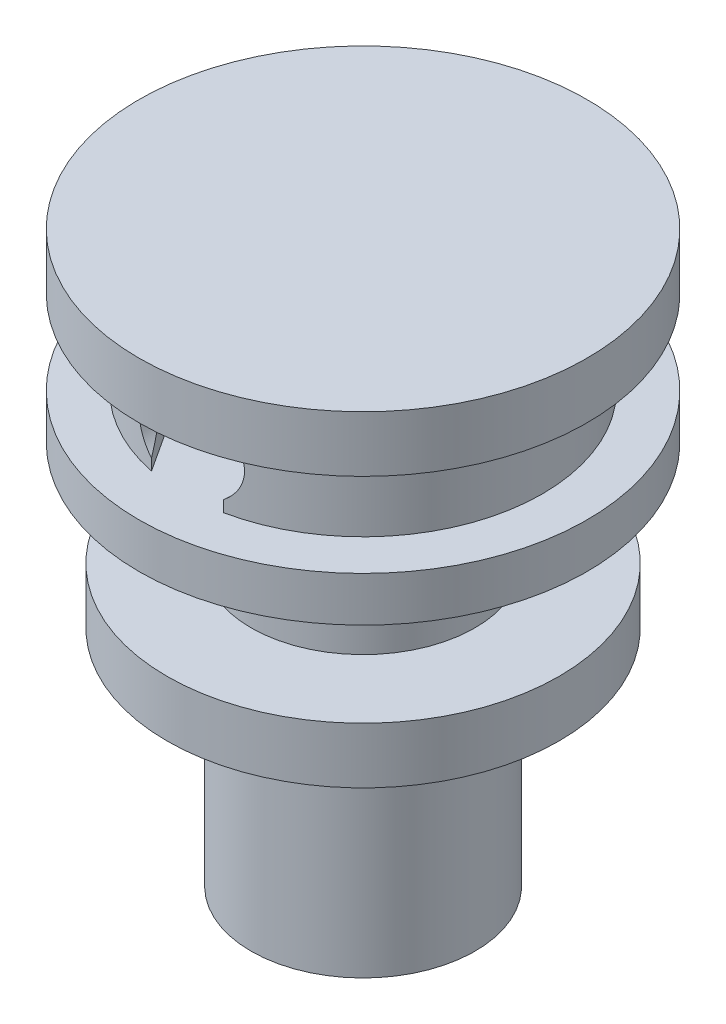
ISO-10303-21;
HEADER;
FILE_DESCRIPTION(('STEP AP214'),'2;1');
FILE_NAME('part.step','',(''),(''),'','','');
FILE_SCHEMA(('AUTOMOTIVE_DESIGN { 1 0 10303 214 1 1 1 1 }'));
ENDSEC;
DATA;
#1=APPLICATION_CONTEXT('core data for automotive mechanical design processes');
#2=APPLICATION_PROTOCOL_DEFINITION('international standard','automotive_design',2000,#1);
#3=PRODUCT_CONTEXT('',#1,'mechanical');
#4=PRODUCT('Part','Part','',(#3));
#5=PRODUCT_RELATED_PRODUCT_CATEGORY('part','',(#4));
#6=PRODUCT_DEFINITION_FORMATION('','',#4);
#7=PRODUCT_DEFINITION_CONTEXT('part definition',#1,'design');
#8=PRODUCT_DEFINITION('design','',#6,#7);
#9=PRODUCT_DEFINITION_SHAPE('','',#8);
#10=(LENGTH_UNIT() NAMED_UNIT(*) SI_UNIT(.MILLI.,.METRE.));
#11=(NAMED_UNIT(*) PLANE_ANGLE_UNIT() SI_UNIT($,.RADIAN.));
#12=(NAMED_UNIT(*) SI_UNIT($,.STERADIAN.) SOLID_ANGLE_UNIT());
#13=UNCERTAINTY_MEASURE_WITH_UNIT(LENGTH_MEASURE(1.E-05),#10,'distance_accuracy_value','');
#14=(GEOMETRIC_REPRESENTATION_CONTEXT(3) GLOBAL_UNCERTAINTY_ASSIGNED_CONTEXT((#13)) GLOBAL_UNIT_ASSIGNED_CONTEXT((#10,
#11,#12)) REPRESENTATION_CONTEXT('',''));
#15=CARTESIAN_POINT('',(0.,0.,0.));
#16=DIRECTION('',(0.,0.,1.));
#17=DIRECTION('',(1.,0.,0.));
#18=AXIS2_PLACEMENT_3D('',#15,#16,#17);
#19=CARTESIAN_POINT('',(0.,4.21,10.));
#20=DIRECTION('',(0.,0.,1.));
#21=DIRECTION('',(-1.,0.,0.));
#22=AXIS2_PLACEMENT_3D('',#19,#20,#21);
#23=ELLIPSE('',#22,0.471075948855967,0.375);
#24=DIRECTION('',(0.,0.,-1.));
#25=VECTOR('',#24,1.);
#26=SURFACE_OF_LINEAR_EXTRUSION('',#23,#25);
#27=CARTESIAN_POINT('',(0.,4.585,1.6));
#28=CARTESIAN_POINT('',(-0.0249516666663415,4.58500013315731,1.6000000267926));
#29=CARTESIAN_POINT('',(-0.0499039383212317,4.58342246563411,1.59941322943097));
#30=CARTESIAN_POINT('',(-0.099598947251716,4.57707482356927,1.59709250950286));
#31=CARTESIAN_POINT('',(-0.124337200657875,4.57227356227364,1.59534734626653));
#32=CARTESIAN_POINT('',(-0.1728641251852,4.55943321698894,1.5908214145249));
#33=CARTESIAN_POINT('',(-0.196652621004165,4.55139353827555,1.58804045580636));
#34=CARTESIAN_POINT('',(-0.246992271708044,4.53026335285002,1.58105978706783));
#35=CARTESIAN_POINT('',(-0.273252439835324,4.51651782073646,1.57669358380344));
#36=CARTESIAN_POINT('',(-0.318465517388156,4.48712808961465,1.56812551900529));
#37=CARTESIAN_POINT('',(-0.337902460227307,4.47220097951506,1.56402131434472));
#38=CARTESIAN_POINT('',(-0.372040789261528,4.44086115468295,1.55623255412026));
#39=CARTESIAN_POINT('',(-0.387023500134319,4.42475839139576,1.5525481831847));
#40=CARTESIAN_POINT('',(-0.412491710729826,4.39201780541613,1.54596397981887));
#41=CARTESIAN_POINT('',(-0.423290974912439,4.37563491800139,1.54302243725282));
#42=CARTESIAN_POINT('',(-0.441187908069004,4.34257079474494,1.53799635852982));
#43=CARTESIAN_POINT('',(-0.448515881475457,4.32602323880347,1.53586144563928));
#44=CARTESIAN_POINT('',(-0.460253564015261,4.29185290921683,1.5323853001843));
#45=CARTESIAN_POINT('',(-0.464667266067415,4.27423164302288,1.53104298193328));
#46=CARTESIAN_POINT('',(-0.470130888659651,4.23929601647315,1.52937404882635));
#47=CARTESIAN_POINT('',(-0.47133294237439,4.22200792166866,1.52900151928137));
#48=CARTESIAN_POINT('',(-0.47074545306544,4.18856418139041,1.5291823098784));
#49=CARTESIAN_POINT('',(-0.469136759731347,4.17240477643029,1.529679662009));
#50=CARTESIAN_POINT('',(-0.463373205413039,4.14057055868185,1.531435357817));
#51=CARTESIAN_POINT('',(-0.459214476183783,4.12489652018363,1.53269485758651));
#52=CARTESIAN_POINT('',(-0.448507508425452,4.0942036143585,1.53586193403231));
#53=CARTESIAN_POINT('',(-0.441925149126799,4.07919771273831,1.53777873660901));
#54=CARTESIAN_POINT('',(-0.426697286338026,4.05033100082443,1.54207435579127));
#55=CARTESIAN_POINT('',(-0.41804779771289,4.03647247285957,1.54445406314279));
#56=CARTESIAN_POINT('',(-0.386722328954688,3.99306235476459,1.55272088761728));
#57=CARTESIAN_POINT('',(-0.360307665645965,3.96623627201828,1.55918460620014));
#58=CARTESIAN_POINT('',(-0.313460754726294,3.9293705571627,1.56910015590525));
#59=CARTESIAN_POINT('',(-0.294826920725884,3.91689782928773,1.5727275159473));
#60=CARTESIAN_POINT('',(-0.250781248864582,3.89164453673094,1.58041954862946));
#61=CARTESIAN_POINT('',(-0.224880625587543,3.87965589761911,1.58434594201211));
#62=CARTESIAN_POINT('',(-0.171414269040135,3.85991898875293,1.59102023441097));
#63=CARTESIAN_POINT('',(-0.143849222124852,3.85216898420324,1.59376861546623));
#64=CARTESIAN_POINT('',(-0.0877782691064239,3.84084998963917,1.59783736046648));
#65=CARTESIAN_POINT('',(-0.0592725432228299,3.83728020348628,1.5991579963273));
#66=CARTESIAN_POINT('',(-0.00201927615530071,3.83430854326594,1.60025496745935));
#67=CARTESIAN_POINT('',(0.0267282512880739,3.83490643394396,1.60003138989743));
#68=CARTESIAN_POINT('',(0.0837828057941562,3.84027085556849,1.59805980740341));
#69=CARTESIAN_POINT('',(0.112089810142329,3.84503760075206,1.59631172412712));
#70=CARTESIAN_POINT('',(0.167560437790685,3.85876249276263,1.59144544020904));
#71=CARTESIAN_POINT('',(0.194723850778796,3.86772140691174,1.58832698874549));
#72=CARTESIAN_POINT('',(0.246141370079146,3.88945557009232,1.58115859373481));
#73=CARTESIAN_POINT('',(0.270466494072745,3.90207450202175,1.57714812384405));
#74=CARTESIAN_POINT('',(0.314423501940366,3.92994619803973,1.56894599024662));
#75=CARTESIAN_POINT('',(0.334281030533592,3.94485485597802,1.56480401295242));
#76=CARTESIAN_POINT('',(0.369093719925617,3.97615243266746,1.55693717042086));
#77=CARTESIAN_POINT('',(0.384346705853856,3.9922076834966,1.55321555947105));
#78=CARTESIAN_POINT('',(0.41032979355762,4.02490322635543,1.5465411386784));
#79=CARTESIAN_POINT('',(0.421373134474747,4.041283892899,1.54354880457716));
#80=CARTESIAN_POINT('',(0.439581273164447,4.0741157888367,1.53845676705662));
#81=CARTESIAN_POINT('',(0.447018979130038,4.09040492783576,1.5362985262503));
#82=CARTESIAN_POINT('',(0.458713234779058,4.1230801339998,1.5328461842998));
#83=CARTESIAN_POINT('',(0.463133093368483,4.1394024453457,1.53150821196028));
#84=CARTESIAN_POINT('',(0.469203037625912,4.1726174407289,1.52965975782721));
#85=CARTESIAN_POINT('',(0.470851690857531,4.18951041514295,1.52914970398951));
#86=CARTESIAN_POINT('',(0.471253212170051,4.22299101283535,1.52902595401815));
#87=CARTESIAN_POINT('',(0.470064030046771,4.2395778941467,1.52939432006743));
#88=CARTESIAN_POINT('',(0.464993281984365,4.27228924526329,1.53094354089086));
#89=CARTESIAN_POINT('',(0.461111695415712,4.28841371152447,1.53212440189045));
#90=CARTESIAN_POINT('',(0.45095992532073,4.3195883238623,1.53514235910241));
#91=CARTESIAN_POINT('',(0.444720899350902,4.33464956545269,1.53697087650171));
#92=CARTESIAN_POINT('',(0.430158085164483,4.36366864313923,1.54111079365168));
#93=CARTESIAN_POINT('',(0.421830365424813,4.37762433233685,1.54342310266091));
#94=CARTESIAN_POINT('',(0.39165797032821,4.42120654615372,1.55147145016712));
#95=CARTESIAN_POINT('',(0.366083066633359,4.44821418018224,1.55782465000811));
#96=CARTESIAN_POINT('',(0.320545468468471,4.48549794875778,1.56766191090465));
#97=CARTESIAN_POINT('',(0.30240793094766,4.49815262514438,1.57128038121385));
#98=CARTESIAN_POINT('',(0.264502927592219,4.52087817441184,1.57810242812948));
#99=CARTESIAN_POINT('',(0.244736100562765,4.53095005363747,1.58130616608792));
#100=CARTESIAN_POINT('',(0.197365808431365,4.55137762679415,1.58801389388489));
#101=CARTESIAN_POINT('',(0.169305259114804,4.56075928112403,1.59127637719777));
#102=CARTESIAN_POINT('',(0.117715743472245,4.57360641825129,1.59583059154853));
#103=CARTESIAN_POINT('',(0.0944042259623301,4.57788030273025,1.597386107106));
#104=CARTESIAN_POINT('',(0.0473952279184029,4.58357652633693,1.59947061716346));
#105=CARTESIAN_POINT('',(0.0236978868175716,4.58499987353362,1.59999997455369));
#106=CARTESIAN_POINT('',(0.,4.585,1.6));
#107=B_SPLINE_CURVE_WITH_KNOTS('',3,(#27,#28,#29,#30,#31,#32,#33,#34,#35,#36,#37,#38,#39,#40,
#41,#42,#43,#44,#45,#46,#47,#48,#49,#50,#51,#52,#53,#54,#55,#56,#57,#58,#59,#60,#61,#62,#63,#64,
#65,#66,#67,#68,#69,#70,#71,#72,#73,#74,#75,#76,#77,#78,#79,#80,#81,#82,#83,#84,#85,#86,#87,#88,
#89,#90,#91,#92,#93,#94,#95,#96,#97,#98,#99,#100,#101,#102,#103,#104,#105,#106),.UNSPECIFIED.,
.T.,.F.,(4,2,2,2,2,2,2,2,2,2,2,2,2,2,2,2,2,2,2,2,2,2,2,2,2,2,2,2,2,2,2,2,2,2,2,2,2,2,2,4),(0.,
0.0748000698317252,0.150336816218589,0.225887441000673,0.315262564446357,0.389483804067796,
0.456083512384266,0.515337100842779,0.569750649792754,0.624089489763648,0.675804518334504,
0.724313371844946,0.772895992922461,0.822190499694185,0.871580817044109,0.984456390022037,
1.05244331972213,1.138420931715,1.22436332826556,1.31028935409637,1.39621052966582,
1.48213612097646,1.56807744600716,1.65078436939579,1.72596613620947,1.79302978907669,
1.852700127529,1.90656190346928,1.95721042052682,2.00788510976724,2.05753388378906,
2.10718303822997,2.15619773008049,2.2053053833228,2.31680884732093,2.38387614223383,
2.45091726562814,2.53977282609225,2.61083945309406,2.68188094352923),.UNSPECIFIED.);
#108=CARTESIAN_POINT('',(0.321234980445988,3.93571412376584,1.56742083925716));
#109=VERTEX_POINT('',#108);
#110=CARTESIAN_POINT('',(0.321234980445938,4.48428587623419,1.56742083925725));
#111=VERTEX_POINT('',#110);
#112=EDGE_CURVE('E274',#109,#111,#107,.T.);
#113=ORIENTED_EDGE('',*,*,#112,.T.);
#114=CARTESIAN_POINT('',(0.299999999999976,4.49912350049587,1.6));
#115=CARTESIAN_POINT('',(0.308824325589217,4.49331556984928,1.58646153112551));
#116=CARTESIAN_POINT('',(0.31757686867623,4.48713563072035,1.57303319249975));
#117=CARTESIAN_POINT('',(0.334873409822488,4.47392006427758,1.54649646948595));
#118=CARTESIAN_POINT('',(0.343417656785577,4.46688552509466,1.53338770322431));
#119=CARTESIAN_POINT('',(0.365199625310765,4.44741533710863,1.49996934168249));
#120=CARTESIAN_POINT('',(0.378246629720245,4.43423403364395,1.47995234873305));
#121=CARTESIAN_POINT('',(0.400350382769181,4.40809649405063,1.44604029849911));
#122=CARTESIAN_POINT('',(0.40963235643288,4.39579256361143,1.43179969616988));
#123=CARTESIAN_POINT('',(0.42712425553453,4.36889666488952,1.40496325080655));
#124=CARTESIAN_POINT('',(0.435336891548286,4.35431069651481,1.39236324914914));
#125=CARTESIAN_POINT('',(0.450837490309993,4.32036211658984,1.36858189931685));
#126=CARTESIAN_POINT('',(0.457917929357147,4.30064697579064,1.35771893843805));
#127=CARTESIAN_POINT('',(0.465094617013786,4.27027581824456,1.34670831088597));
#128=CARTESIAN_POINT('',(0.466864066403541,4.2609494158477,1.34399358382315));
#129=CARTESIAN_POINT('',(0.469522575136062,4.24189433650641,1.3399148429195));
#130=CARTESIAN_POINT('',(0.470413555481191,4.23216658600212,1.3385478818358));
#131=CARTESIAN_POINT('',(0.471227499603108,4.21252795439128,1.33729911137188));
#132=CARTESIAN_POINT('',(0.471146028612521,4.20261644028251,1.33742410590653));
#133=CARTESIAN_POINT('',(0.470014177314502,4.18298106902563,1.33916061635287));
#134=CARTESIAN_POINT('',(0.468963229102018,4.17325732527937,1.34077300355663));
#135=CARTESIAN_POINT('',(0.465762747426198,4.15275055070116,1.34568325093056));
#136=CARTESIAN_POINT('',(0.463464522978282,4.14204648220178,1.34920923598651));
#137=CARTESIAN_POINT('',(0.457947969286884,4.12145482296824,1.35767285053604));
#138=CARTESIAN_POINT('',(0.454727012491342,4.11156966929083,1.36261451127614));
#139=CARTESIAN_POINT('',(0.445683232424548,4.08759785808701,1.37648967189929));
#140=CARTESIAN_POINT('',(0.439392563895484,4.07410954679804,1.3861409499737));
#141=CARTESIAN_POINT('',(0.425796948996981,4.04899762946014,1.40699963285796));
#142=CARTESIAN_POINT('',(0.418489765507429,4.0373782615912,1.41821046990529));
#143=CARTESIAN_POINT('',(0.403616103034143,4.01627191106623,1.44102996068769));
#144=CARTESIAN_POINT('',(0.396082572413675,4.00670573085064,1.4525880643398));
#145=CARTESIAN_POINT('',(0.38061524077466,3.98877438609746,1.47631837504161));
#146=CARTESIAN_POINT('',(0.372681783488343,3.98040821317461,1.48849005472997));
#147=CARTESIAN_POINT('',(0.354210003945529,3.96243133848214,1.51682985360392));
#148=CARTESIAN_POINT('',(0.343576794361991,3.95315117827122,1.53314355095417));
#149=CARTESIAN_POINT('',(0.321994077839357,3.93601679296321,1.5662562158161));
#150=CARTESIAN_POINT('',(0.311045189796265,3.92815997200498,1.58305423380432));
#151=CARTESIAN_POINT('',(0.3,3.92087649950416,1.6));
#152=B_SPLINE_CURVE_WITH_KNOTS('',3,(#114,#115,#116,#117,#118,#119,#120,#121,#122,#123,#124,
#125,#126,#127,#128,#129,#130,#131,#132,#133,#134,#135,#136,#137,#138,#139,#140,#141,#142,#143,
#144,#145,#146,#147,#148,#149,#150,#151),.UNSPECIFIED.,.F.,.F.,(4,2,2,2,2,2,2,2,2,2,2,2,2,2,2,2,
2,2,4),(0.,0.0515125158506016,0.102960116913512,0.184623877243026,0.247410381585806,
0.310034499713859,0.379693815256563,0.409195411914093,0.438632351574288,0.46820358655937,
0.497792154932826,0.532107972467316,0.566522495163951,0.619438957461331,0.672473775648586,
0.722766093412375,0.773015898993106,0.837667720028184,0.902200416365118),.UNSPECIFIED.);
#153=EDGE_CURVE('E240',#111,#109,#152,.T.);
#154=ORIENTED_EDGE('',*,*,#153,.T.);
#155=EDGE_LOOP('',(#113,#154));
#156=FACE_BOUND('',#155,.T.);
#157=ADVANCED_FACE('F41',(#156),#26,.T.);
#158=CARTESIAN_POINT('',(-0.321234980439296,4.48428587623912,1.56742083926742));
#159=VERTEX_POINT('',#158);
#160=CARTESIAN_POINT('',(-0.321234980445937,3.9357141237658,1.56742083925725));
#161=VERTEX_POINT('',#160);
#162=EDGE_CURVE('E280',#159,#161,#107,.T.);
#163=ORIENTED_EDGE('',*,*,#162,.T.);
#164=CARTESIAN_POINT('',(-0.299999999999992,3.92087649950415,1.6));
#165=CARTESIAN_POINT('',(-0.308775442744063,3.92665358641785,1.58653652823107));
#166=CARTESIAN_POINT('',(-0.317480543292269,3.9327970343205,1.57318097696208));
#167=CARTESIAN_POINT('',(-0.334779682921818,3.94600205323621,1.54664026729968));
#168=CARTESIAN_POINT('',(-0.34337180615782,3.95307200746986,1.53345804823713));
#169=CARTESIAN_POINT('',(-0.36536124052828,3.97273149509576,1.49972138816244));
#170=CARTESIAN_POINT('',(-0.378560493252709,3.98609403854094,1.47947081259502));
#171=CARTESIAN_POINT('',(-0.403769281696246,4.01599088099337,1.4407949507112));
#172=CARTESIAN_POINT('',(-0.415784753697826,4.0325079894521,1.4223605568234));
#173=CARTESIAN_POINT('',(-0.43707964931693,4.06879788340671,1.38968947294173));
#174=CARTESIAN_POINT('',(-0.446482576179517,4.08830508787119,1.37526330163031));
#175=CARTESIAN_POINT('',(-0.457863245414421,4.12107182178553,1.35780283571146));
#176=CARTESIAN_POINT('',(-0.461219554217597,4.1326937741849,1.35265351502904));
#177=CARTESIAN_POINT('',(-0.466588618425199,4.15693323953674,1.34441618199721));
#178=CARTESIAN_POINT('',(-0.468606218707414,4.16954697563442,1.34132073653276));
#179=CARTESIAN_POINT('',(-0.470653198577242,4.19161722867266,1.33818021627723));
#180=CARTESIAN_POINT('',(-0.471085007020409,4.20095060793,1.33751772653698));
#181=CARTESIAN_POINT('',(-0.471066622177007,4.21961567297613,1.33754593295656));
#182=CARTESIAN_POINT('',(-0.470616534912641,4.22894735883363,1.33823646645487));
#183=CARTESIAN_POINT('',(-0.468882189618805,4.24729876865605,1.34089733606365));
#184=CARTESIAN_POINT('',(-0.467601545288711,4.25631966660894,1.34286212795932));
#185=CARTESIAN_POINT('',(-0.464317151276616,4.27392030306302,1.34790111543255));
#186=CARTESIAN_POINT('',(-0.462311783448188,4.2824990048702,1.35097779360494));
#187=CARTESIAN_POINT('',(-0.456466977001105,4.30358591126736,1.35994502054606));
#188=CARTESIAN_POINT('',(-0.452221866950179,4.31571511689273,1.36645795909451));
#189=CARTESIAN_POINT('',(-0.442765417531324,4.33861036209446,1.38096624585553));
#190=CARTESIAN_POINT('',(-0.437552680560002,4.34937439152091,1.38896373830108));
#191=CARTESIAN_POINT('',(-0.42719614374873,4.36833460520203,1.40485295837224));
#192=CARTESIAN_POINT('',(-0.422133494372789,4.37668231147029,1.41262018322196));
#193=CARTESIAN_POINT('',(-0.411643447592471,4.39255254452913,1.42871423714045));
#194=CARTESIAN_POINT('',(-0.406216195376433,4.4000753966801,1.43704084345817));
#195=CARTESIAN_POINT('',(-0.392939708665759,4.4171662284905,1.45740991305761));
#196=CARTESIAN_POINT('',(-0.384964025628581,4.4264031829978,1.46964637639521));
#197=CARTESIAN_POINT('',(-0.368638801823724,4.44372276725118,1.49469288358903));
#198=CARTESIAN_POINT('',(-0.360288769721925,4.45180381793521,1.50750368126056));
#199=CARTESIAN_POINT('',(-0.343376841104508,4.46692318353533,1.53345032351434));
#200=CARTESIAN_POINT('',(-0.334816525763618,4.47396749236716,1.54658374222454));
#201=CARTESIAN_POINT('',(-0.317526171731071,4.48717040841337,1.57311097283629));
#202=CARTESIAN_POINT('',(-0.308796768804965,4.49333179641568,1.58650380933275));
#203=CARTESIAN_POINT('',(-0.299999999999999,4.49912350049584,1.6));
#204=B_SPLINE_CURVE_WITH_KNOTS('',3,(#164,#165,#166,#167,#168,#169,#170,#171,#172,#173,#174,
#175,#176,#177,#178,#179,#180,#181,#182,#183,#184,#185,#186,#187,#188,#189,#190,#191,#192,#193,
#194,#195,#196,#197,#198,#199,#200,#201,#202,#203),.UNSPECIFIED.,.F.,.F.,(4,2,2,2,2,2,2,2,2,2,2,
2,2,2,2,2,2,2,2,4),(0.,0.05122980363515,0.102960094703863,0.185615482186666,0.267832674126874,
0.344948722309352,0.384186641383041,0.423281769734272,0.451250371544903,0.479215611154318,
0.507059984803219,0.534966916790347,0.577940353916962,0.620976350135464,0.658350609771927,
0.695710073841775,0.747486015376612,0.799332025188227,0.850865400636376,0.902232724125518),.UNSPECIFIED.);
#205=EDGE_CURVE('E224',#161,#159,#204,.T.);
#206=ORIENTED_EDGE('',*,*,#205,.T.);
#207=EDGE_LOOP('',(#163,#206));
#208=FACE_BOUND('',#207,.T.);
#209=ADVANCED_FACE('F328',(#208),#26,.T.);
#210=CARTESIAN_POINT('',(0.,3.835,-1.6));
#211=CARTESIAN_POINT('',(-0.0249494456214496,3.83500197745911,-1.60001412200571));
#212=CARTESIAN_POINT('',(-0.0499039032245325,3.83657832870394,-1.59941686806651));
#213=CARTESIAN_POINT('',(-0.0993567584125904,3.84289344230721,-1.59710018235505));
#214=CARTESIAN_POINT('',(-0.123855132131248,3.84763236968397,-1.59538069202633));
#215=CARTESIAN_POINT('',(-0.171930219504408,3.8602871401895,-1.59091983155549));
#216=CARTESIAN_POINT('',(-0.195506810586363,3.86820340425335,-1.58817832601973));
#217=CARTESIAN_POINT('',(-0.241227807103635,3.8872435671857,-1.58187890899549));
#218=CARTESIAN_POINT('',(-0.263371842587824,3.89836829060816,-1.57832078768993));
#219=CARTESIAN_POINT('',(-0.305641862624175,3.92386569793366,-1.57068276950363));
#220=CARTESIAN_POINT('',(-0.325766909119507,3.93823988159356,-1.56660263207003));
#221=CARTESIAN_POINT('',(-0.36162760649537,3.96885136757436,-1.55869598803223));
#222=CARTESIAN_POINT('',(-0.377592393695361,3.9848197947229,-1.5548780880415));
#223=CARTESIAN_POINT('',(-0.405093417441832,4.01768282403543,-1.54792789256031));
#224=CARTESIAN_POINT('',(-0.41691000922092,4.03433428557196,-1.54476505991917));
#225=CARTESIAN_POINT('',(-0.437455097358184,4.06953215303122,-1.53907350098515));
#226=CARTESIAN_POINT('',(-0.446189928984575,4.08807456924117,-1.53654347696382));
#227=CARTESIAN_POINT('',(-0.458603833659857,4.12278566149282,-1.53287831828598));
#228=CARTESIAN_POINT('',(-0.462940445067056,4.13870068448089,-1.53156644402305));
#229=CARTESIAN_POINT('',(-0.46897510613281,4.17104248751384,-1.52972959086935));
#230=CARTESIAN_POINT('',(-0.470678787531865,4.18746809839016,-1.529202932516));
#231=CARTESIAN_POINT('',(-0.471345234619064,4.2201739058796,-1.52899764002302));
#232=CARTESIAN_POINT('',(-0.470341935042902,4.23645335960872,-1.52930850659294));
#233=CARTESIAN_POINT('',(-0.465703317123405,4.2688003667178,-1.53072732342492));
#234=CARTESIAN_POINT('',(-0.462035550948278,4.28486279765063,-1.53184509914894));
#235=CARTESIAN_POINT('',(-0.452256715953447,4.31617488872344,-1.53476046041047));
#236=CARTESIAN_POINT('',(-0.446141201742191,4.33142301256795,-1.53655928248317));
#237=CARTESIAN_POINT('',(-0.424002653701126,4.37664278661307,-1.54287470647658));
#238=CARTESIAN_POINT('',(-0.404404375165499,4.40477610520531,-1.54823128758082));
#239=CARTESIAN_POINT('',(-0.354577999359128,4.45962659721609,-1.56045979735794));
#240=CARTESIAN_POINT('',(-0.323048511718027,4.4850989585724,-1.5674279366997));
#241=CARTESIAN_POINT('',(-0.268262379526303,4.51895319353602,-1.57749310658904));
#242=CARTESIAN_POINT('',(-0.246696201540544,4.53010429531287,-1.58102818476149));
#243=CARTESIAN_POINT('',(-0.202123385352983,4.54932650807297,-1.58734063529765));
#244=CARTESIAN_POINT('',(-0.179117197761278,4.55739857699846,-1.59011824324713));
#245=CARTESIAN_POINT('',(-0.130682150091907,4.57089676018608,-1.59485055630471));
#246=CARTESIAN_POINT('',(-0.10519206196043,4.57612346417955,-1.59674217740335));
#247=CARTESIAN_POINT('',(-0.0531403256818272,4.58320998593548,-1.59933850641657));
#248=CARTESIAN_POINT('',(-0.0265674159326429,4.58499686526382,-1.60001748007357));
#249=CARTESIAN_POINT('',(0.,4.585,-1.6));
#250=B_SPLINE_CURVE_WITH_KNOTS('',3,(#210,#211,#212,#213,#214,#215,#216,#217,#218,#219,#220,
#221,#222,#223,#224,#225,#226,#227,#228,#229,#230,#231,#232,#233,#234,#235,#236,#237,#238,#239,
#240,#241,#242,#243,#244,#245,#246,#247,#248,#249),.UNSPECIFIED.,.F.,.F.,(4,2,2,2,2,2,2,2,2,2,2,
2,2,2,2,2,2,2,2,4),(0.,0.0748000698317251,0.14960404292036,0.224417929347849,0.299251059634141,
0.374118799198016,0.442507653977477,0.504211030233364,0.56578681158134,0.615211374911093,
0.66453007387618,0.713233395070669,0.762539984865273,0.811936530376014,0.914557211357656,
1.03633526034344,1.10972782124555,1.18309752974796,1.26110308618062,1.34074521164775),.UNSPECIFIED.);
#251=CARTESIAN_POINT('',(-0.321234980437957,3.93571412375988,-1.56742083926948));
#252=VERTEX_POINT('',#251);
#253=CARTESIAN_POINT('',(-0.321234980445937,4.4842858762342,-1.56742083925725));
#254=VERTEX_POINT('',#253);
#255=EDGE_CURVE('E247',#252,#254,#250,.T.);
#256=ORIENTED_EDGE('',*,*,#255,.T.);
#257=CARTESIAN_POINT('',(-0.3,4.49912350049584,-1.6));
#258=CARTESIAN_POINT('',(-0.30881806132744,4.49331772425756,-1.5864711418898));
#259=CARTESIAN_POINT('',(-0.317568362419384,4.48714059034963,-1.57304624298077));
#260=CARTESIAN_POINT('',(-0.334900988598293,4.47390053962526,-1.5464541575388));
#261=CARTESIAN_POINT('',(-0.343482640012887,4.46683467736134,-1.53328800456842));
#262=CARTESIAN_POINT('',(-0.360480867480521,4.45162585561057,-1.50720896077464));
#263=CARTESIAN_POINT('',(-0.368894449195772,4.44347154258804,-1.49430066392825));
#264=CARTESIAN_POINT('',(-0.385337542138219,4.42598613050668,-1.46907331938493));
#265=CARTESIAN_POINT('',(-0.393367604679534,4.41665679536286,-1.45675342585008));
#266=CARTESIAN_POINT('',(-0.408006845119061,4.39773116849213,-1.43429359036093));
#267=CARTESIAN_POINT('',(-0.414673699855482,4.38828623386612,-1.42406515936902));
#268=CARTESIAN_POINT('',(-0.427404419299323,4.36809046632294,-1.40453341757217));
#269=CARTESIAN_POINT('',(-0.433468135650784,4.35733931354849,-1.3952303343781));
#270=CARTESIAN_POINT('',(-0.444792926791898,4.33414500057022,-1.37785559782472));
#271=CARTESIAN_POINT('',(-0.450039088852139,4.32167682485146,-1.3698068238935));
#272=CARTESIAN_POINT('',(-0.459103065886624,4.29511146386857,-1.35590067665089));
#273=CARTESIAN_POINT('',(-0.462927999833377,4.28102287362987,-1.35003238125976));
#274=CARTESIAN_POINT('',(-0.467449902991919,4.25731925412662,-1.34309478081127));
#275=CARTESIAN_POINT('',(-0.468785221562195,4.24811258089658,-1.34104610652808));
#276=CARTESIAN_POINT('',(-0.470590915982927,4.22941639993364,-1.33827577156427));
#277=CARTESIAN_POINT('',(-0.47106187577653,4.21992708755348,-1.33755321498559));
#278=CARTESIAN_POINT('',(-0.471089405903206,4.20093059143084,-1.33751097767699));
#279=CARTESIAN_POINT('',(-0.470644699508594,4.19142340122649,-1.33819325572996));
#280=CARTESIAN_POINT('',(-0.468887374899754,4.17268458857223,-1.34088938069482));
#281=CARTESIAN_POINT('',(-0.467574139830627,4.16345316685522,-1.34290417399868));
#282=CARTESIAN_POINT('',(-0.461586405258415,4.13165593767436,-1.35209068432345));
#283=CARTESIAN_POINT('',(-0.454847248457039,4.11038671038846,-1.36243004268837));
#284=CARTESIAN_POINT('',(-0.440361471451125,4.07579760885615,-1.38465443129852));
#285=CARTESIAN_POINT('',(-0.433079230293137,4.06173769227003,-1.39582700128781));
#286=CARTESIAN_POINT('',(-0.417466419034179,4.03566824444094,-1.4197805099311));
#287=CARTESIAN_POINT('',(-0.409133572449838,4.02366330333183,-1.43256494121453));
#288=CARTESIAN_POINT('',(-0.392862875064129,4.00275003383697,-1.45752779281099));
#289=CARTESIAN_POINT('',(-0.384998738690528,3.99364283896787,-1.46959311887383));
#290=CARTESIAN_POINT('',(-0.368924357836315,3.97657119449246,-1.49425477745284));
#291=CARTESIAN_POINT('',(-0.360714566490576,3.96860530555617,-1.5068504147598));
#292=CARTESIAN_POINT('',(-0.343868801815904,3.95348941375372,-1.53269554687885));
#293=CARTESIAN_POINT('',(-0.33522754749475,3.94635941356352,-1.54595314390205));
#294=CARTESIAN_POINT('',(-0.317747162242832,3.93298594965275,-1.57277192447109));
#295=CARTESIAN_POINT('',(-0.308908134335475,3.92674203625399,-1.58633294995621));
#296=CARTESIAN_POINT('',(-0.299999999999995,3.92087649950416,-1.60000000000001));
#297=B_SPLINE_CURVE_WITH_KNOTS('',3,(#257,#258,#259,#260,#261,#262,#263,#264,#265,#266,#267,
#268,#269,#270,#271,#272,#273,#274,#275,#276,#277,#278,#279,#280,#281,#282,#283,#284,#285,#286,
#287,#288,#289,#290,#291,#292,#293,#294,#295,#296),.UNSPECIFIED.,.F.,.F.,(4,2,2,2,2,2,2,2,2,2,2,
2,2,2,2,2,2,2,2,4),(0.,0.0514913879437637,0.103158163539085,0.155413540308953,0.207591387215732,
0.253827937325358,0.300075832414083,0.347087661554401,0.393860726882455,0.422319532465065,
0.450759104772369,0.479238357671309,0.50773785913525,0.580009825933333,0.637958198390476,
0.696034365512586,0.747100975422089,0.798102606103326,0.850146614828771,0.902164116677907),.UNSPECIFIED.);
#298=EDGE_CURVE('E215',#254,#252,#297,.T.);
#299=ORIENTED_EDGE('',*,*,#298,.T.);
#300=EDGE_LOOP('',(#256,#299));
#301=FACE_BOUND('',#300,.T.);
#302=ADVANCED_FACE('F334',(#301),#26,.T.);
#303=CARTESIAN_POINT('',(0.,4.585,-1.6));
#304=CARTESIAN_POINT('',(0.0249494454782896,4.58499802279458,-1.60001412204601));
#305=CARTESIAN_POINT('',(0.0499039031529505,4.58342167142291,-1.59941686808666));
#306=CARTESIAN_POINT('',(0.0993567584841757,4.57710655756594,-1.5971001823349));
#307=CARTESIAN_POINT('',(0.123855132274423,4.57236763006232,-1.59538069198603));
#308=CARTESIAN_POINT('',(0.171930219361214,4.55971286006424,-1.59091983159579));
#309=CARTESIAN_POINT('',(0.195506810085155,4.5517965966348,-1.5881783261608));
#310=CARTESIAN_POINT('',(0.241227807604972,4.53275643192592,-1.58187890885438));
#311=CARTESIAN_POINT('',(0.263371844450163,4.52163170609175,-1.57832078716575));
#312=CARTESIAN_POINT('',(0.305641860760975,4.49613430536797,-1.57068277002805));
#313=CARTESIAN_POINT('',(0.325766902166784,4.48176013072679,-1.56660263402695));
#314=CARTESIAN_POINT('',(0.36162761284642,4.45114862117146,-1.55869598624467));
#315=CARTESIAN_POINT('',(0.377592416445672,4.43518016496313,-1.55487808163819));
#316=CARTESIAN_POINT('',(0.405083153673546,4.40232945274392,-1.54793048706024));
#317=CARTESIAN_POINT('',(0.416891376652319,4.38569199539517,-1.54477004800335));
#318=CARTESIAN_POINT('',(0.437441299522187,4.35049709169015,-1.53907749682523));
#319=CARTESIAN_POINT('',(0.446184524079478,4.33194060591009,-1.53654507248558));
#320=CARTESIAN_POINT('',(0.45860022901105,4.29722436774104,-1.5328793827503));
#321=CARTESIAN_POINT('',(0.462934733606038,4.28131998204259,-1.53156817140569));
#322=CARTESIAN_POINT('',(0.468972921629313,4.24897911864968,-1.52973026609294));
#323=CARTESIAN_POINT('',(0.470678815865152,4.23254309998158,-1.52920291286973));
#324=CARTESIAN_POINT('',(0.471349854509981,4.19958676729416,-1.52899622784451));
#325=CARTESIAN_POINT('',(0.470311200305424,4.18306636806218,-1.52931807137895));
#326=CARTESIAN_POINT('',(0.465556253031383,4.15045201193073,-1.53077214218669));
#327=CARTESIAN_POINT('',(0.461838946195551,4.13435821887676,-1.53190467627393));
#328=CARTESIAN_POINT('',(0.452006164322229,4.10317894301114,-1.53483416627296));
#329=CARTESIAN_POINT('',(0.445915901954176,4.08808474999049,-1.53662412592728));
#330=CARTESIAN_POINT('',(0.431636440733135,4.05898258779821,-1.54069644384638));
#331=CARTESIAN_POINT('',(0.423443680157641,4.04497651492274,-1.54297963662059));
#332=CARTESIAN_POINT('',(0.393780656957887,4.00132641117383,-1.55093055899324));
#333=CARTESIAN_POINT('',(0.368610301061321,3.97427516735645,-1.55723070225953));
#334=CARTESIAN_POINT('',(0.30639582542442,3.92244938830062,-1.57077164628013));
#335=CARTESIAN_POINT('',(0.267966446213756,3.89936515725409,-1.57792973769537));
#336=CARTESIAN_POINT('',(0.203021918742453,3.87090079059742,-1.58726032217826));
#337=CARTESIAN_POINT('',(0.178009694988788,3.86213820597682,-1.590276818388));
#338=CARTESIAN_POINT('',(0.12796346785516,3.84851381437099,-1.59506183053255));
#339=CARTESIAN_POINT('',(0.102975143659258,3.84350267770458,-1.59687774040371));
#340=CARTESIAN_POINT('',(0.0519935543527561,3.83671236732014,-1.59936780778014));
#341=CARTESIAN_POINT('',(0.025990185494963,3.8350000821189,-1.60001831726238));
#342=CARTESIAN_POINT('',(0.,3.835,-1.6));
#343=B_SPLINE_CURVE_WITH_KNOTS('',3,(#303,#304,#305,#306,#307,#308,#309,#310,#311,#312,#313,
#314,#315,#316,#317,#318,#319,#320,#321,#322,#323,#324,#325,#326,#327,#328,#329,#330,#331,#332,
#333,#334,#335,#336,#337,#338,#339,#340,#341,#342),.UNSPECIFIED.,.F.,.F.,(4,2,2,2,2,2,2,2,2,2,2,
2,2,2,2,2,2,2,2,4),(0.,0.0748000698317252,0.14960404292036,0.22441792934785,0.299251059634142,
0.374118799198016,0.442507653977477,0.50416257500818,0.565786782479113,0.615179192615687,
0.664530038269104,0.713949224107914,0.763387123025615,0.812313471091813,0.861323256011383,
0.972236060279012,1.10659655110683,1.18636799872533,1.26276497291343,1.34069533473465),.UNSPECIFIED.);
#344=CARTESIAN_POINT('',(0.321234980437945,4.48428587624013,-1.5674208392695));
#345=VERTEX_POINT('',#344);
#346=CARTESIAN_POINT('',(0.321234980445938,3.9357141237658,-1.56742083925725));
#347=VERTEX_POINT('',#346);
#348=EDGE_CURVE('E255',#345,#347,#343,.T.);
#349=ORIENTED_EDGE('',*,*,#348,.T.);
#350=CARTESIAN_POINT('',(0.3,3.92087649950416,-1.6));
#351=CARTESIAN_POINT('',(0.308775437325199,3.92665358282582,-1.58653653654481));
#352=CARTESIAN_POINT('',(0.31748053252494,3.93279702670665,-1.57318099348155));
#353=CARTESIAN_POINT('',(0.334779672384952,3.94600204457509,-1.54664028346556));
#354=CARTESIAN_POINT('',(0.343371800957633,3.95307200284419,-1.53345805621537));
#355=CARTESIAN_POINT('',(0.365361253506159,3.97273150666095,-1.4997213682515));
#356=CARTESIAN_POINT('',(0.378560518635206,3.98609406405556,-1.47947077365265));
#357=CARTESIAN_POINT('',(0.403769304829903,4.01599091303842,-1.44079491521906));
#358=CARTESIAN_POINT('',(0.415784764325377,4.03250800786493,-1.42236054051838));
#359=CARTESIAN_POINT('',(0.437079649260068,4.06879788302674,-1.38968947302897));
#360=CARTESIAN_POINT('',(0.446482575980507,4.08830508664278,-1.37526330193564));
#361=CARTESIAN_POINT('',(0.457863284615088,4.1210719349839,-1.35780277556896));
#362=CARTESIAN_POINT('',(0.461219622894753,4.13269401277544,-1.35265340966308));
#363=CARTESIAN_POINT('',(0.466588659963279,4.15693349772067,-1.3444161182686));
#364=CARTESIAN_POINT('',(0.468606230755345,4.16954710690436,-1.34132071804857));
#365=CARTESIAN_POINT('',(0.470653172621273,4.19161694783835,-1.33818025609944));
#366=CARTESIAN_POINT('',(0.471084981170103,4.20095003878898,-1.33751776619707));
#367=CARTESIAN_POINT('',(0.471066649090576,4.21961509833547,-1.33754589166519));
#368=CARTESIAN_POINT('',(0.470616560648784,4.22894706696506,-1.33823642696994));
#369=CARTESIAN_POINT('',(0.468882123563649,4.24729948706354,-1.34089743740689));
#370=CARTESIAN_POINT('',(0.467601350015669,4.25632109983337,-1.3428624275514));
#371=CARTESIAN_POINT('',(0.464316837954659,4.27392159431929,-1.3479015961378));
#372=CARTESIAN_POINT('',(0.462311592589058,4.28249951034915,-1.3509780864251));
#373=CARTESIAN_POINT('',(0.456468418229724,4.30358099346555,-1.35994280938231));
#374=CARTESIAN_POINT('',(0.45222536571582,4.31570636987831,-1.36645259121351));
#375=CARTESIAN_POINT('',(0.442769521869289,4.33860070733916,-1.38095994889252));
#376=CARTESIAN_POINT('',(0.437554561680606,4.3493665425631,-1.38896085224566));
#377=CARTESIAN_POINT('',(0.422296107062578,4.37731305692387,-1.41237069935861));
#378=CARTESIAN_POINT('',(0.411570249674548,4.39323082789306,-1.42882653895019));
#379=CARTESIAN_POINT('',(0.389005472027228,4.42218147176382,-1.46344590297402));
#380=CARTESIAN_POINT('',(0.377162109304336,4.43520207468471,-1.48161624312884));
#381=CARTESIAN_POINT('',(0.354485483389432,4.45732516276259,-1.51640720715472));
#382=CARTESIAN_POINT('',(0.343735578377803,4.46671995980585,-1.53289994112426));
#383=CARTESIAN_POINT('',(0.322020632882544,4.48396484363228,-1.56621547450143));
#384=CARTESIAN_POINT('',(0.311059623684052,4.49183183820693,-1.58303208902526));
#385=CARTESIAN_POINT('',(0.299999999999985,4.49912350049584,-1.60000000000002));
#386=B_SPLINE_CURVE_WITH_KNOTS('',3,(#350,#351,#352,#353,#354,#355,#356,#357,#358,#359,#360,
#361,#362,#363,#364,#365,#366,#367,#368,#369,#370,#371,#372,#373,#374,#375,#376,#377,#378,#379,
#380,#381,#382,#383,#384,#385),.UNSPECIFIED.,.F.,.F.,(4,2,2,2,2,2,2,2,2,2,2,2,2,2,2,2,2,4),(0.,
0.0512297719450379,0.102960094701239,0.185615561348435,0.267832674224534,0.344948722407009,
0.384187041226148,0.423281770321691,0.451249518509161,0.47921561174527,0.507062136340203,
0.534966916451398,0.577923126135783,0.620976367964727,0.696400133238611,0.772137494848463,
0.837517373158122,0.902126344986852),.UNSPECIFIED.);
#387=EDGE_CURVE('E186',#347,#345,#386,.T.);
#388=ORIENTED_EDGE('',*,*,#387,.T.);
#389=EDGE_LOOP('',(#349,#388));
#390=FACE_BOUND('',#389,.T.);
#391=ADVANCED_FACE('F267',(#390),#26,.T.);
#392=CARTESIAN_POINT('',(0.,4.585,0.));
#393=DIRECTION('',(0.,-1.,0.));
#394=DIRECTION('',(0.,0.,-1.));
#395=AXIS2_PLACEMENT_3D('',#392,#393,#394);
#396=CYLINDRICAL_SURFACE('',#395,1.6);
#397=DIRECTION('',(0.,-1.,0.));
#398=VECTOR('',#397,1.);
#399=CARTESIAN_POINT('',(0.321234980445938,4.585,1.56742083925725));
#400=LINE('',#399,#398);
#401=CARTESIAN_POINT('',(0.321234980445938,3.835,1.56742083925725));
#402=VERTEX_POINT('',#401);
#403=EDGE_CURVE('E66',#402,#109,#400,.F.);
#404=ORIENTED_EDGE('',*,*,#403,.F.);
#405=CARTESIAN_POINT('',(0.,3.835,0.));
#406=DIRECTION('',(0.,1.,0.));
#407=DIRECTION('',(0.,0.,1.));
#408=AXIS2_PLACEMENT_3D('',#405,#406,#407);
#409=CIRCLE('',#408,1.6);
#410=CARTESIAN_POINT('',(0.321234980445938,3.835,-1.56742083925725));
#411=VERTEX_POINT('',#410);
#412=EDGE_CURVE('E11',#402,#411,#409,.T.);
#413=ORIENTED_EDGE('',*,*,#412,.T.);
#414=DIRECTION('',(0.,-1.,0.));
#415=VECTOR('',#414,1.);
#416=CARTESIAN_POINT('',(0.321234980445938,4.585,-1.56742083925725));
#417=LINE('',#416,#415);
#418=EDGE_CURVE('E152',#347,#411,#417,.T.);
#419=ORIENTED_EDGE('',*,*,#418,.F.);
#420=ORIENTED_EDGE('',*,*,#348,.F.);
#421=CARTESIAN_POINT('',(0.321234980445938,4.585,-1.56742083925725));
#422=VERTEX_POINT('',#421);
#423=EDGE_CURVE('E187',#422,#345,#417,.T.);
#424=ORIENTED_EDGE('',*,*,#423,.F.);
#425=CARTESIAN_POINT('',(0.,4.585,0.));
#426=DIRECTION('',(0.,1.,0.));
#427=DIRECTION('',(0.,0.,1.));
#428=AXIS2_PLACEMENT_3D('',#425,#426,#427);
#429=CIRCLE('',#428,1.6);
#430=CARTESIAN_POINT('',(0.321234980445938,4.585,1.56742083925725));
#431=VERTEX_POINT('',#430);
#432=EDGE_CURVE('E288',#431,#422,#429,.T.);
#433=ORIENTED_EDGE('',*,*,#432,.F.);
#434=EDGE_CURVE('E232',#111,#431,#400,.F.);
#435=ORIENTED_EDGE('',*,*,#434,.F.);
#436=ORIENTED_EDGE('',*,*,#112,.F.);
#437=EDGE_LOOP('',(#404,#413,#419,#420,#424,#433,#435,#436));
#438=FACE_BOUND('',#437,.T.);
#439=ADVANCED_FACE('F261',(#438),#396,.T.);
#440=DIRECTION('',(0.,-1.,0.));
#441=VECTOR('',#440,1.);
#442=CARTESIAN_POINT('',(-0.321234980445937,4.585,1.56742083925725));
#443=LINE('',#442,#441);
#444=CARTESIAN_POINT('',(-0.321234980445937,4.585,1.56742083925725));
#445=VERTEX_POINT('',#444);
#446=EDGE_CURVE('E225',#445,#159,#443,.T.);
#447=ORIENTED_EDGE('',*,*,#446,.F.);
#448=CARTESIAN_POINT('',(-0.321234980445938,4.585,-1.56742083925725));
#449=VERTEX_POINT('',#448);
#450=EDGE_CURVE('E284',#449,#445,#429,.T.);
#451=ORIENTED_EDGE('',*,*,#450,.F.);
#452=DIRECTION('',(0.,-1.,0.));
#453=VECTOR('',#452,1.);
#454=CARTESIAN_POINT('',(-0.321234980445937,4.585,-1.56742083925725));
#455=LINE('',#454,#453);
#456=EDGE_CURVE('E196',#254,#449,#455,.F.);
#457=ORIENTED_EDGE('',*,*,#456,.F.);
#458=ORIENTED_EDGE('',*,*,#255,.F.);
#459=CARTESIAN_POINT('',(-0.321234980445937,3.835,-1.56742083925725));
#460=VERTEX_POINT('',#459);
#461=EDGE_CURVE('E222',#460,#252,#455,.F.);
#462=ORIENTED_EDGE('',*,*,#461,.F.);
#463=CARTESIAN_POINT('',(-0.321234980445937,3.835,1.56742083925725));
#464=VERTEX_POINT('',#463);
#465=EDGE_CURVE('E50',#460,#464,#409,.T.);
#466=ORIENTED_EDGE('',*,*,#465,.T.);
#467=EDGE_CURVE('E139',#161,#464,#443,.T.);
#468=ORIENTED_EDGE('',*,*,#467,.F.);
#469=ORIENTED_EDGE('',*,*,#162,.F.);
#470=EDGE_LOOP('',(#447,#451,#457,#458,#462,#466,#468,#469));
#471=FACE_BOUND('',#470,.T.);
#472=ADVANCED_FACE('F266',(#471),#396,.T.);
#473=CARTESIAN_POINT('',(0.,2.,0.));
#474=DIRECTION('',(0.,-1.,0.));
#475=DIRECTION('',(0.,0.,-1.));
#476=AXIS2_PLACEMENT_3D('',#473,#474,#475);
#477=CYLINDRICAL_SURFACE('',#476,1.);
#478=CARTESIAN_POINT('',(0.,2.,0.));
#479=DIRECTION('',(0.,1.,0.));
#480=DIRECTION('',(0.,0.,1.));
#481=AXIS2_PLACEMENT_3D('',#478,#479,#480);
#482=CIRCLE('',#481,1.);
#483=CARTESIAN_POINT('',(0.,2.,1.));
#484=VERTEX_POINT('',#483);
#485=EDGE_CURVE('E304',#484,#484,#482,.T.);
#486=ORIENTED_EDGE('',*,*,#485,.F.);
#487=EDGE_LOOP('',(#486));
#488=FACE_BOUND('',#487,.T.);
#489=CARTESIAN_POINT('',(0.,0.,0.));
#490=DIRECTION('',(0.,1.,0.));
#491=DIRECTION('',(0.,0.,1.));
#492=AXIS2_PLACEMENT_3D('',#489,#490,#491);
#493=CIRCLE('',#492,1.);
#494=CARTESIAN_POINT('',(0.,0.,1.));
#495=VERTEX_POINT('',#494);
#496=EDGE_CURVE('E45',#495,#495,#493,.T.);
#497=ORIENTED_EDGE('',*,*,#496,.T.);
#498=EDGE_LOOP('',(#497));
#499=FACE_BOUND('',#498,.T.);
#500=ADVANCED_FACE('F43',(#488,#499),#477,.T.);
#501=CARTESIAN_POINT('',(0.,0.,0.));
#502=DIRECTION('',(0.,1.,0.));
#503=DIRECTION('',(0.,0.,1.));
#504=AXIS2_PLACEMENT_3D('',#501,#502,#503);
#505=PLANE('',#504);
#506=ORIENTED_EDGE('',*,*,#496,.F.);
#507=EDGE_LOOP('',(#506));
#508=FACE_BOUND('',#507,.T.);
#509=ADVANCED_FACE('F316',(#508),#505,.F.);
#510=CARTESIAN_POINT('',(0.,2.5,0.));
#511=DIRECTION('',(0.,-1.,0.));
#512=DIRECTION('',(0.,0.,-1.));
#513=AXIS2_PLACEMENT_3D('',#510,#511,#512);
#514=CYLINDRICAL_SURFACE('',#513,1.75);
#515=CARTESIAN_POINT('',(0.,2.5,0.));
#516=DIRECTION('',(0.,1.,0.));
#517=DIRECTION('',(0.,0.,1.));
#518=AXIS2_PLACEMENT_3D('',#515,#516,#517);
#519=CIRCLE('',#518,1.75);
#520=CARTESIAN_POINT('',(0.,2.5,1.75));
#521=VERTEX_POINT('',#520);
#522=EDGE_CURVE('E305',#521,#521,#519,.T.);
#523=ORIENTED_EDGE('',*,*,#522,.F.);
#524=EDGE_LOOP('',(#523));
#525=FACE_BOUND('',#524,.T.);
#526=CARTESIAN_POINT('',(0.,2.,0.));
#527=DIRECTION('',(0.,1.,0.));
#528=DIRECTION('',(0.,0.,1.));
#529=AXIS2_PLACEMENT_3D('',#526,#527,#528);
#530=CIRCLE('',#529,1.75);
#531=CARTESIAN_POINT('',(0.,2.,1.75));
#532=VERTEX_POINT('',#531);
#533=EDGE_CURVE('E301',#532,#532,#530,.T.);
#534=ORIENTED_EDGE('',*,*,#533,.T.);
#535=EDGE_LOOP('',(#534));
#536=FACE_BOUND('',#535,.T.);
#537=ADVANCED_FACE('F318',(#525,#536),#514,.T.);
#538=CARTESIAN_POINT('',(0.,2.5,0.));
#539=DIRECTION('',(0.,1.,0.));
#540=DIRECTION('',(0.,0.,1.));
#541=AXIS2_PLACEMENT_3D('',#538,#539,#540);
#542=PLANE('',#541);
#543=CARTESIAN_POINT('',(0.,2.5,0.));
#544=DIRECTION('',(0.,1.,0.));
#545=DIRECTION('',(0.,0.,1.));
#546=AXIS2_PLACEMENT_3D('',#543,#544,#545);
#547=CIRCLE('',#546,1.);
#548=CARTESIAN_POINT('',(0.,2.5,1.));
#549=VERTEX_POINT('',#548);
#550=EDGE_CURVE('E292',#549,#549,#547,.T.);
#551=ORIENTED_EDGE('',*,*,#550,.F.);
#552=EDGE_LOOP('',(#551));
#553=FACE_BOUND('',#552,.T.);
#554=ORIENTED_EDGE('',*,*,#522,.T.);
#555=EDGE_LOOP('',(#554));
#556=FACE_BOUND('',#555,.T.);
#557=ADVANCED_FACE('F323',(#553,#556),#542,.T.);
#558=CARTESIAN_POINT('',(0.,2.,0.));
#559=DIRECTION('',(0.,1.,0.));
#560=DIRECTION('',(0.,0.,1.));
#561=AXIS2_PLACEMENT_3D('',#558,#559,#560);
#562=PLANE('',#561);
#563=ORIENTED_EDGE('',*,*,#485,.T.);
#564=EDGE_LOOP('',(#563));
#565=FACE_BOUND('',#564,.T.);
#566=ORIENTED_EDGE('',*,*,#533,.F.);
#567=EDGE_LOOP('',(#566));
#568=FACE_BOUND('',#567,.T.);
#569=ADVANCED_FACE('F394',(#565,#568),#562,.F.);
#570=CARTESIAN_POINT('',(0.,3.435,0.));
#571=DIRECTION('',(0.,-1.,0.));
#572=DIRECTION('',(0.,0.,-1.));
#573=AXIS2_PLACEMENT_3D('',#570,#571,#572);
#574=CYLINDRICAL_SURFACE('',#573,1.);
#575=CARTESIAN_POINT('',(0.,3.435,0.));
#576=DIRECTION('',(0.,1.,0.));
#577=DIRECTION('',(0.,0.,1.));
#578=AXIS2_PLACEMENT_3D('',#575,#576,#577);
#579=CIRCLE('',#578,1.);
#580=CARTESIAN_POINT('',(0.,3.435,1.));
#581=VERTEX_POINT('',#580);
#582=EDGE_CURVE('E296',#581,#581,#579,.T.);
#583=ORIENTED_EDGE('',*,*,#582,.F.);
#584=EDGE_LOOP('',(#583));
#585=FACE_BOUND('',#584,.T.);
#586=ORIENTED_EDGE('',*,*,#550,.T.);
#587=EDGE_LOOP('',(#586));
#588=FACE_BOUND('',#587,.T.);
#589=ADVANCED_FACE('F391',(#585,#588),#574,.T.);
#590=CARTESIAN_POINT('',(0.,3.835,0.));
#591=DIRECTION('',(0.,-1.,0.));
#592=DIRECTION('',(0.,0.,-1.));
#593=AXIS2_PLACEMENT_3D('',#590,#591,#592);
#594=CYLINDRICAL_SURFACE('',#593,2.);
#595=CARTESIAN_POINT('',(0.,3.835,0.));
#596=DIRECTION('',(0.,1.,0.));
#597=DIRECTION('',(0.,0.,1.));
#598=AXIS2_PLACEMENT_3D('',#595,#596,#597);
#599=CIRCLE('',#598,2.);
#600=CARTESIAN_POINT('',(0.,3.835,2.));
#601=VERTEX_POINT('',#600);
#602=EDGE_CURVE('E293',#601,#601,#599,.T.);
#603=ORIENTED_EDGE('',*,*,#602,.F.);
#604=EDGE_LOOP('',(#603));
#605=FACE_BOUND('',#604,.T.);
#606=CARTESIAN_POINT('',(0.,3.435,0.));
#607=DIRECTION('',(0.,1.,0.));
#608=DIRECTION('',(0.,0.,1.));
#609=AXIS2_PLACEMENT_3D('',#606,#607,#608);
#610=CIRCLE('',#609,2.);
#611=CARTESIAN_POINT('',(0.,3.435,2.));
#612=VERTEX_POINT('',#611);
#613=EDGE_CURVE('E290',#612,#612,#610,.T.);
#614=ORIENTED_EDGE('',*,*,#613,.T.);
#615=EDGE_LOOP('',(#614));
#616=FACE_BOUND('',#615,.T.);
#617=ADVANCED_FACE('F387',(#605,#616),#594,.T.);
#618=CARTESIAN_POINT('',(0.,3.835,0.));
#619=DIRECTION('',(0.,1.,0.));
#620=DIRECTION('',(0.,0.,1.));
#621=AXIS2_PLACEMENT_3D('',#618,#619,#620);
#622=PLANE('',#621);
#623=DIRECTION('',(0.54604588725566,0.,0.837755267969817));
#624=VECTOR('',#623,1.);
#625=CARTESIAN_POINT('',(0.3,3.835,-1.6));
#626=LINE('',#625,#624);
#627=CARTESIAN_POINT('',(0.942474676466045,3.835,-0.614301623162617));
#628=VERTEX_POINT('',#627);
#629=EDGE_CURVE('E160',#411,#628,#626,.T.);
#630=ORIENTED_EDGE('',*,*,#629,.F.);
#631=ORIENTED_EDGE('',*,*,#412,.F.);
#632=DIRECTION('',(-0.546045887255659,0.,0.837755267969817));
#633=VECTOR('',#632,1.);
#634=CARTESIAN_POINT('',(0.3,3.835,1.6));
#635=LINE('',#634,#633);
#636=CARTESIAN_POINT('',(0.942474676466044,3.835,0.614301623162618));
#637=VERTEX_POINT('',#636);
#638=EDGE_CURVE('E145',#637,#402,#635,.T.);
#639=ORIENTED_EDGE('',*,*,#638,.F.);
#640=CARTESIAN_POINT('',(0.,3.835,0.));
#641=DIRECTION('',(0.,-1.,0.));
#642=DIRECTION('',(0.,0.,-1.));
#643=AXIS2_PLACEMENT_3D('',#640,#641,#642);
#644=CIRCLE('',#643,1.125);
#645=EDGE_CURVE('E165',#628,#637,#644,.T.);
#646=ORIENTED_EDGE('',*,*,#645,.F.);
#647=EDGE_LOOP('',(#630,#631,#639,#646));
#648=FACE_BOUND('',#647,.T.);
#649=DIRECTION('',(-0.54604588725566,0.,-0.837755267969817));
#650=VECTOR('',#649,1.);
#651=CARTESIAN_POINT('',(-0.3,3.835,1.6));
#652=LINE('',#651,#650);
#653=CARTESIAN_POINT('',(-0.942474676466045,3.835,0.614301623162617));
#654=VERTEX_POINT('',#653);
#655=EDGE_CURVE('E133',#464,#654,#652,.T.);
#656=ORIENTED_EDGE('',*,*,#655,.F.);
#657=ORIENTED_EDGE('',*,*,#465,.F.);
#658=DIRECTION('',(0.54604588725566,0.,-0.837755267969817));
#659=VECTOR('',#658,1.);
#660=CARTESIAN_POINT('',(-0.3,3.835,-1.6));
#661=LINE('',#660,#659);
#662=CARTESIAN_POINT('',(-0.942474676466045,3.835,-0.614301623162617));
#663=VERTEX_POINT('',#662);
#664=EDGE_CURVE('E158',#663,#460,#661,.T.);
#665=ORIENTED_EDGE('',*,*,#664,.F.);
#666=CARTESIAN_POINT('',(0.,3.835,0.));
#667=DIRECTION('',(0.,-1.,0.));
#668=DIRECTION('',(0.,0.,-1.));
#669=AXIS2_PLACEMENT_3D('',#666,#667,#668);
#670=CIRCLE('',#669,1.125);
#671=EDGE_CURVE('E144',#654,#663,#670,.T.);
#672=ORIENTED_EDGE('',*,*,#671,.F.);
#673=EDGE_LOOP('',(#656,#657,#665,#672));
#674=FACE_BOUND('',#673,.T.);
#675=ORIENTED_EDGE('',*,*,#602,.T.);
#676=EDGE_LOOP('',(#675));
#677=FACE_BOUND('',#676,.T.);
#678=ADVANCED_FACE('F156',(#648,#674,#677),#622,.T.);
#679=CARTESIAN_POINT('',(0.,3.435,0.));
#680=DIRECTION('',(0.,1.,0.));
#681=DIRECTION('',(0.,0.,1.));
#682=AXIS2_PLACEMENT_3D('',#679,#680,#681);
#683=PLANE('',#682);
#684=ORIENTED_EDGE('',*,*,#582,.T.);
#685=EDGE_LOOP('',(#684));
#686=FACE_BOUND('',#685,.T.);
#687=ORIENTED_EDGE('',*,*,#613,.F.);
#688=EDGE_LOOP('',(#687));
#689=FACE_BOUND('',#688,.T.);
#690=ADVANCED_FACE('F373',(#686,#689),#683,.F.);
#691=CARTESIAN_POINT('',(0.,5.085,0.));
#692=DIRECTION('',(0.,-1.,0.));
#693=DIRECTION('',(0.,0.,-1.));
#694=AXIS2_PLACEMENT_3D('',#691,#692,#693);
#695=CYLINDRICAL_SURFACE('',#694,2.);
#696=CARTESIAN_POINT('',(0.,5.085,0.));
#697=DIRECTION('',(0.,1.,0.));
#698=DIRECTION('',(0.,0.,1.));
#699=AXIS2_PLACEMENT_3D('',#696,#697,#698);
#700=CIRCLE('',#699,2.);
#701=CARTESIAN_POINT('',(0.,5.085,2.));
#702=VERTEX_POINT('',#701);
#703=EDGE_CURVE('E281',#702,#702,#700,.T.);
#704=ORIENTED_EDGE('',*,*,#703,.F.);
#705=EDGE_LOOP('',(#704));
#706=FACE_BOUND('',#705,.T.);
#707=CARTESIAN_POINT('',(0.,4.585,0.));
#708=DIRECTION('',(0.,1.,0.));
#709=DIRECTION('',(0.,0.,1.));
#710=AXIS2_PLACEMENT_3D('',#707,#708,#709);
#711=CIRCLE('',#710,2.);
#712=CARTESIAN_POINT('',(0.,4.585,2.));
#713=VERTEX_POINT('',#712);
#714=EDGE_CURVE('E285',#713,#713,#711,.T.);
#715=ORIENTED_EDGE('',*,*,#714,.T.);
#716=EDGE_LOOP('',(#715));
#717=FACE_BOUND('',#716,.T.);
#718=ADVANCED_FACE('F269',(#706,#717),#695,.T.);
#719=CARTESIAN_POINT('',(0.,5.085,0.));
#720=DIRECTION('',(0.,1.,0.));
#721=DIRECTION('',(0.,0.,1.));
#722=AXIS2_PLACEMENT_3D('',#719,#720,#721);
#723=PLANE('',#722);
#724=ORIENTED_EDGE('',*,*,#703,.T.);
#725=EDGE_LOOP('',(#724));
#726=FACE_BOUND('',#725,.T.);
#727=ADVANCED_FACE('F370',(#726),#723,.T.);
#728=CARTESIAN_POINT('',(0.,4.585,0.));
#729=DIRECTION('',(0.,1.,0.));
#730=DIRECTION('',(0.,0.,1.));
#731=AXIS2_PLACEMENT_3D('',#728,#729,#730);
#732=PLANE('',#731);
#733=ORIENTED_EDGE('',*,*,#432,.T.);
#734=DIRECTION('',(0.54604588725566,0.,0.837755267969817));
#735=VECTOR('',#734,1.);
#736=CARTESIAN_POINT('',(0.3,4.585,-1.6));
#737=LINE('',#736,#735);
#738=CARTESIAN_POINT('',(0.942474676466045,4.585,-0.614301623162617));
#739=VERTEX_POINT('',#738);
#740=EDGE_CURVE('E175',#422,#739,#737,.T.);
#741=ORIENTED_EDGE('',*,*,#740,.T.);
#742=CARTESIAN_POINT('',(0.,4.585,0.));
#743=DIRECTION('',(0.,-1.,0.));
#744=DIRECTION('',(0.,0.,-1.));
#745=AXIS2_PLACEMENT_3D('',#742,#743,#744);
#746=CIRCLE('',#745,1.125);
#747=CARTESIAN_POINT('',(0.942474676466044,4.585,0.614301623162618));
#748=VERTEX_POINT('',#747);
#749=EDGE_CURVE('E177',#739,#748,#746,.T.);
#750=ORIENTED_EDGE('',*,*,#749,.T.);
#751=DIRECTION('',(-0.546045887255659,0.,0.837755267969817));
#752=VECTOR('',#751,1.);
#753=CARTESIAN_POINT('',(0.3,4.585,1.6));
#754=LINE('',#753,#752);
#755=EDGE_CURVE('E168',#748,#431,#754,.T.);
#756=ORIENTED_EDGE('',*,*,#755,.T.);
#757=EDGE_LOOP('',(#733,#741,#750,#756));
#758=FACE_BOUND('',#757,.T.);
#759=ORIENTED_EDGE('',*,*,#450,.T.);
#760=DIRECTION('',(-0.54604588725566,0.,-0.837755267969817));
#761=VECTOR('',#760,1.);
#762=CARTESIAN_POINT('',(-0.3,4.585,1.6));
#763=LINE('',#762,#761);
#764=CARTESIAN_POINT('',(-0.942474676466045,4.585,0.614301623162617));
#765=VERTEX_POINT('',#764);
#766=EDGE_CURVE('E171',#445,#765,#763,.T.);
#767=ORIENTED_EDGE('',*,*,#766,.T.);
#768=CARTESIAN_POINT('',(0.,4.585,0.));
#769=DIRECTION('',(0.,-1.,0.));
#770=DIRECTION('',(0.,0.,-1.));
#771=AXIS2_PLACEMENT_3D('',#768,#769,#770);
#772=CIRCLE('',#771,1.125);
#773=CARTESIAN_POINT('',(-0.942474676466045,4.585,-0.614301623162617));
#774=VERTEX_POINT('',#773);
#775=EDGE_CURVE('E151',#765,#774,#772,.T.);
#776=ORIENTED_EDGE('',*,*,#775,.T.);
#777=DIRECTION('',(0.54604588725566,0.,-0.837755267969817));
#778=VECTOR('',#777,1.);
#779=CARTESIAN_POINT('',(-0.3,4.585,-1.6));
#780=LINE('',#779,#778);
#781=EDGE_CURVE('E58',#774,#449,#780,.T.);
#782=ORIENTED_EDGE('',*,*,#781,.T.);
#783=EDGE_LOOP('',(#759,#767,#776,#782));
#784=FACE_BOUND('',#783,.T.);
#785=ORIENTED_EDGE('',*,*,#714,.F.);
#786=EDGE_LOOP('',(#785));
#787=FACE_BOUND('',#786,.T.);
#788=ADVANCED_FACE('F239',(#758,#784,#787),#732,.F.);
#789=CARTESIAN_POINT('',(0.3,3.835,1.6));
#790=DIRECTION('',(-0.837755267969817,0.,-0.546045887255659));
#791=DIRECTION('',(-0.546045887255659,0.,0.837755267969817));
#792=AXIS2_PLACEMENT_3D('',#789,#790,#791);
#793=PLANE('',#792);
#794=ORIENTED_EDGE('',*,*,#403,.T.);
#795=ORIENTED_EDGE('',*,*,#153,.F.);
#796=ORIENTED_EDGE('',*,*,#434,.T.);
#797=ORIENTED_EDGE('',*,*,#755,.F.);
#798=DIRECTION('',(0.,1.,0.));
#799=VECTOR('',#798,1.);
#800=CARTESIAN_POINT('',(0.942474676466044,3.835,0.614301623162618));
#801=LINE('',#800,#799);
#802=EDGE_CURVE('E167',#637,#748,#801,.T.);
#803=ORIENTED_EDGE('',*,*,#802,.F.);
#804=ORIENTED_EDGE('',*,*,#638,.T.);
#805=EDGE_LOOP('',(#794,#795,#796,#797,#803,#804));
#806=FACE_BOUND('',#805,.T.);
#807=ADVANCED_FACE('F236',(#806),#793,.T.);
#808=CARTESIAN_POINT('',(-0.3,3.835,1.6));
#809=DIRECTION('',(0.837755267969816,0.,-0.54604588725566));
#810=DIRECTION('',(-0.54604588725566,0.,-0.837755267969816));
#811=AXIS2_PLACEMENT_3D('',#808,#809,#810);
#812=PLANE('',#811);
#813=ORIENTED_EDGE('',*,*,#446,.T.);
#814=ORIENTED_EDGE('',*,*,#205,.F.);
#815=ORIENTED_EDGE('',*,*,#467,.T.);
#816=ORIENTED_EDGE('',*,*,#655,.T.);
#817=DIRECTION('',(0.,1.,0.));
#818=VECTOR('',#817,1.);
#819=CARTESIAN_POINT('',(-0.942474676466045,3.835,0.614301623162617));
#820=LINE('',#819,#818);
#821=EDGE_CURVE('E136',#654,#765,#820,.T.);
#822=ORIENTED_EDGE('',*,*,#821,.T.);
#823=ORIENTED_EDGE('',*,*,#766,.F.);
#824=EDGE_LOOP('',(#813,#814,#815,#816,#822,#823));
#825=FACE_BOUND('',#824,.T.);
#826=ADVANCED_FACE('F135',(#825),#812,.T.);
#827=CARTESIAN_POINT('',(-0.3,3.835,-1.6));
#828=DIRECTION('',(0.837755267969817,0.,0.54604588725566));
#829=DIRECTION('',(0.54604588725566,0.,-0.837755267969817));
#830=AXIS2_PLACEMENT_3D('',#827,#828,#829);
#831=PLANE('',#830);
#832=ORIENTED_EDGE('',*,*,#461,.T.);
#833=ORIENTED_EDGE('',*,*,#298,.F.);
#834=ORIENTED_EDGE('',*,*,#456,.T.);
#835=ORIENTED_EDGE('',*,*,#781,.F.);
#836=DIRECTION('',(0.,1.,0.));
#837=VECTOR('',#836,1.);
#838=CARTESIAN_POINT('',(-0.942474676466045,3.835,-0.614301623162617));
#839=LINE('',#838,#837);
#840=EDGE_CURVE('E153',#663,#774,#839,.T.);
#841=ORIENTED_EDGE('',*,*,#840,.F.);
#842=ORIENTED_EDGE('',*,*,#664,.T.);
#843=EDGE_LOOP('',(#832,#833,#834,#835,#841,#842));
#844=FACE_BOUND('',#843,.T.);
#845=ADVANCED_FACE('F207',(#844),#831,.T.);
#846=CARTESIAN_POINT('',(0.3,3.835,-1.6));
#847=DIRECTION('',(-0.837755267969817,0.,0.54604588725566));
#848=DIRECTION('',(0.54604588725566,0.,0.837755267969817));
#849=AXIS2_PLACEMENT_3D('',#846,#847,#848);
#850=PLANE('',#849);
#851=ORIENTED_EDGE('',*,*,#423,.T.);
#852=ORIENTED_EDGE('',*,*,#387,.F.);
#853=ORIENTED_EDGE('',*,*,#418,.T.);
#854=ORIENTED_EDGE('',*,*,#629,.T.);
#855=DIRECTION('',(0.,1.,0.));
#856=VECTOR('',#855,1.);
#857=CARTESIAN_POINT('',(0.942474676466045,3.835,-0.614301623162617));
#858=LINE('',#857,#856);
#859=EDGE_CURVE('E181',#628,#739,#858,.T.);
#860=ORIENTED_EDGE('',*,*,#859,.T.);
#861=ORIENTED_EDGE('',*,*,#740,.F.);
#862=EDGE_LOOP('',(#851,#852,#853,#854,#860,#861));
#863=FACE_BOUND('',#862,.T.);
#864=ADVANCED_FACE('F202',(#863),#850,.T.);
#865=CARTESIAN_POINT('',(0.,3.835,0.));
#866=DIRECTION('',(0.,1.,0.));
#867=DIRECTION('',(0.,0.,1.));
#868=AXIS2_PLACEMENT_3D('',#865,#866,#867);
#869=CYLINDRICAL_SURFACE('',#868,1.125);
#870=ORIENTED_EDGE('',*,*,#775,.F.);
#871=ORIENTED_EDGE('',*,*,#821,.F.);
#872=ORIENTED_EDGE('',*,*,#671,.T.);
#873=ORIENTED_EDGE('',*,*,#840,.T.);
#874=EDGE_LOOP('',(#870,#871,#872,#873));
#875=FACE_BOUND('',#874,.T.);
#876=ADVANCED_FACE('F148',(#875),#869,.F.);
#877=CARTESIAN_POINT('',(0.,3.835,0.));
#878=DIRECTION('',(0.,1.,0.));
#879=DIRECTION('',(0.,0.,1.));
#880=AXIS2_PLACEMENT_3D('',#877,#878,#879);
#881=CYLINDRICAL_SURFACE('',#880,1.125);
#882=ORIENTED_EDGE('',*,*,#749,.F.);
#883=ORIENTED_EDGE('',*,*,#859,.F.);
#884=ORIENTED_EDGE('',*,*,#645,.T.);
#885=ORIENTED_EDGE('',*,*,#802,.T.);
#886=EDGE_LOOP('',(#882,#883,#884,#885));
#887=FACE_BOUND('',#886,.T.);
#888=ADVANCED_FACE('F209',(#887),#881,.F.);
#889=CLOSED_SHELL('',(#157,#209,#302,#391,#439,#472,#500,#509,#537,#557,#569,#589,#617,#678,
#690,#718,#727,#788,#807,#826,#845,#864,#876,#888));
#890=MANIFOLD_SOLID_BREP('B2',#889);
#891=ADVANCED_BREP_SHAPE_REPRESENTATION('',(#18,#890),#14);
#892=SHAPE_DEFINITION_REPRESENTATION(#9,#891);
ENDSEC;
END-ISO-10303-21;
